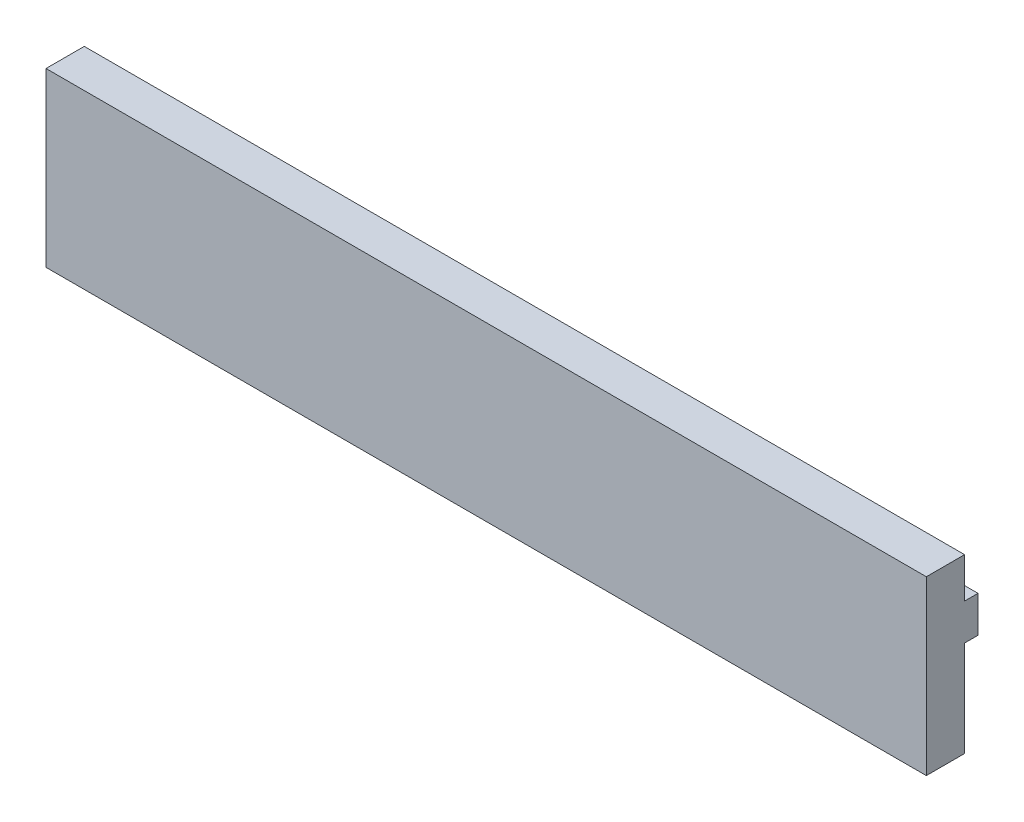
ISO-10303-21;
HEADER;
FILE_DESCRIPTION(('STEP AP214'),'2;1');
FILE_NAME('part.step','',(''),(''),'','','');
FILE_SCHEMA(('AUTOMOTIVE_DESIGN { 1 0 10303 214 1 1 1 1 }'));
ENDSEC;
DATA;
#1=APPLICATION_CONTEXT('core data for automotive mechanical design processes');
#2=APPLICATION_PROTOCOL_DEFINITION('international standard','automotive_design',2000,#1);
#3=PRODUCT_CONTEXT('',#1,'mechanical');
#4=PRODUCT('Part','Part','',(#3));
#5=PRODUCT_RELATED_PRODUCT_CATEGORY('part','',(#4));
#6=PRODUCT_DEFINITION_FORMATION('','',#4);
#7=PRODUCT_DEFINITION_CONTEXT('part definition',#1,'design');
#8=PRODUCT_DEFINITION('design','',#6,#7);
#9=PRODUCT_DEFINITION_SHAPE('','',#8);
#10=(LENGTH_UNIT() NAMED_UNIT(*) SI_UNIT(.MILLI.,.METRE.));
#11=(NAMED_UNIT(*) PLANE_ANGLE_UNIT() SI_UNIT($,.RADIAN.));
#12=(NAMED_UNIT(*) SI_UNIT($,.STERADIAN.) SOLID_ANGLE_UNIT());
#13=UNCERTAINTY_MEASURE_WITH_UNIT(LENGTH_MEASURE(1.E-05),#10,'distance_accuracy_value','');
#14=(GEOMETRIC_REPRESENTATION_CONTEXT(3) GLOBAL_UNCERTAINTY_ASSIGNED_CONTEXT((#13)) GLOBAL_UNIT_ASSIGNED_CONTEXT((#10,
#11,#12)) REPRESENTATION_CONTEXT('',''));
#15=CARTESIAN_POINT('',(0.,0.,0.));
#16=DIRECTION('',(0.,0.,1.));
#17=DIRECTION('',(1.,0.,0.));
#18=AXIS2_PLACEMENT_3D('',#15,#16,#17);
#19=CARTESIAN_POINT('',(0.,0.,0.));
#20=DIRECTION('',(0.,0.,1.));
#21=DIRECTION('',(1.,0.,0.));
#22=AXIS2_PLACEMENT_3D('',#19,#20,#21);
#23=PLANE('',#22);
#24=DIRECTION('',(-1.,0.,0.));
#25=VECTOR('',#24,1.);
#26=CARTESIAN_POINT('',(230.,5.00000000000002,0.));
#27=LINE('',#26,#25);
#28=CARTESIAN_POINT('',(230.,5.00000000000001,0.));
#29=VERTEX_POINT('',#28);
#30=CARTESIAN_POINT('',(-230.,5.00000000000001,0.));
#31=VERTEX_POINT('',#30);
#32=EDGE_CURVE('E57',#29,#31,#27,.T.);
#33=ORIENTED_EDGE('',*,*,#32,.F.);
#34=DIRECTION('',(0.,1.,0.));
#35=VECTOR('',#34,1.);
#36=CARTESIAN_POINT('',(230.,-45.,0.));
#37=LINE('',#36,#35);
#38=CARTESIAN_POINT('',(230.,-45.,0.));
#39=VERTEX_POINT('',#38);
#40=EDGE_CURVE('E162',#39,#29,#37,.T.);
#41=ORIENTED_EDGE('',*,*,#40,.F.);
#42=DIRECTION('',(1.,0.,0.));
#43=VECTOR('',#42,1.);
#44=CARTESIAN_POINT('',(230.,-45.,0.));
#45=LINE('',#44,#43);
#46=CARTESIAN_POINT('',(-230.,-45.,0.));
#47=VERTEX_POINT('',#46);
#48=EDGE_CURVE('E158',#47,#39,#45,.T.);
#49=ORIENTED_EDGE('',*,*,#48,.F.);
#50=DIRECTION('',(0.,-1.,0.));
#51=VECTOR('',#50,1.);
#52=CARTESIAN_POINT('',(-230.,-45.,0.));
#53=LINE('',#52,#51);
#54=EDGE_CURVE('E62',#31,#47,#53,.T.);
#55=ORIENTED_EDGE('',*,*,#54,.F.);
#56=EDGE_LOOP('',(#33,#41,#49,#55));
#57=FACE_BOUND('',#56,.T.);
#58=ADVANCED_FACE('F41',(#57),#23,.F.);
#59=DIRECTION('',(1.,0.,0.));
#60=VECTOR('',#59,1.);
#61=CARTESIAN_POINT('',(230.,24.,0.));
#62=LINE('',#61,#60);
#63=CARTESIAN_POINT('',(-230.,24.,0.));
#64=VERTEX_POINT('',#63);
#65=CARTESIAN_POINT('',(230.,24.,0.));
#66=VERTEX_POINT('',#65);
#67=EDGE_CURVE('E195',#64,#66,#62,.T.);
#68=ORIENTED_EDGE('',*,*,#67,.F.);
#69=CARTESIAN_POINT('',(-230.,45.,0.));
#70=VERTEX_POINT('',#69);
#71=EDGE_CURVE('E132',#70,#64,#53,.T.);
#72=ORIENTED_EDGE('',*,*,#71,.F.);
#73=DIRECTION('',(-1.,0.,0.));
#74=VECTOR('',#73,1.);
#75=CARTESIAN_POINT('',(230.,45.,0.));
#76=LINE('',#75,#74);
#77=CARTESIAN_POINT('',(230.,45.,0.));
#78=VERTEX_POINT('',#77);
#79=EDGE_CURVE('E147',#78,#70,#76,.T.);
#80=ORIENTED_EDGE('',*,*,#79,.F.);
#81=EDGE_CURVE('E161',#66,#78,#37,.T.);
#82=ORIENTED_EDGE('',*,*,#81,.F.);
#83=EDGE_LOOP('',(#68,#72,#80,#82));
#84=FACE_BOUND('',#83,.T.);
#85=ADVANCED_FACE('F210',(#84),#23,.F.);
#86=CARTESIAN_POINT('',(-230.,-45.,20.));
#87=DIRECTION('',(1.,0.,0.));
#88=DIRECTION('',(0.,0.,-1.));
#89=AXIS2_PLACEMENT_3D('',#86,#87,#88);
#90=PLANE('',#89);
#91=ORIENTED_EDGE('',*,*,#71,.T.);
#92=DIRECTION('',(0.,0.,1.));
#93=VECTOR('',#92,1.);
#94=CARTESIAN_POINT('',(-230.,24.,-7.));
#95=LINE('',#94,#93);
#96=CARTESIAN_POINT('',(-230.,24.,-7.));
#97=VERTEX_POINT('',#96);
#98=EDGE_CURVE('E111',#97,#64,#95,.T.);
#99=ORIENTED_EDGE('',*,*,#98,.F.);
#100=DIRECTION('',(0.,1.,0.));
#101=VECTOR('',#100,1.);
#102=CARTESIAN_POINT('',(-230.,24.,-7.));
#103=LINE('',#102,#101);
#104=CARTESIAN_POINT('',(-230.,5.00000000000002,-7.));
#105=VERTEX_POINT('',#104);
#106=EDGE_CURVE('E118',#105,#97,#103,.T.);
#107=ORIENTED_EDGE('',*,*,#106,.F.);
#108=DIRECTION('',(0.,0.,1.));
#109=VECTOR('',#108,1.);
#110=CARTESIAN_POINT('',(-230.,5.00000000000002,-7.));
#111=LINE('',#110,#109);
#112=EDGE_CURVE('E185',#105,#31,#111,.T.);
#113=ORIENTED_EDGE('',*,*,#112,.T.);
#114=ORIENTED_EDGE('',*,*,#54,.T.);
#115=DIRECTION('',(0.,0.,-1.));
#116=VECTOR('',#115,1.);
#117=CARTESIAN_POINT('',(-230.,-45.,20.));
#118=LINE('',#117,#116);
#119=CARTESIAN_POINT('',(-230.,-45.,20.));
#120=VERTEX_POINT('',#119);
#121=EDGE_CURVE('E11',#120,#47,#118,.T.);
#122=ORIENTED_EDGE('',*,*,#121,.F.);
#123=DIRECTION('',(0.,-1.,0.));
#124=VECTOR('',#123,1.);
#125=CARTESIAN_POINT('',(-230.,-45.,20.));
#126=LINE('',#125,#124);
#127=CARTESIAN_POINT('',(-230.,45.,20.));
#128=VERTEX_POINT('',#127);
#129=EDGE_CURVE('E142',#128,#120,#126,.T.);
#130=ORIENTED_EDGE('',*,*,#129,.F.);
#131=DIRECTION('',(0.,0.,-1.));
#132=VECTOR('',#131,1.);
#133=CARTESIAN_POINT('',(-230.,45.,20.));
#134=LINE('',#133,#132);
#135=EDGE_CURVE('E155',#128,#70,#134,.T.);
#136=ORIENTED_EDGE('',*,*,#135,.T.);
#137=EDGE_LOOP('',(#91,#99,#107,#113,#114,#122,#130,#136));
#138=FACE_BOUND('',#137,.T.);
#139=ADVANCED_FACE('F43',(#138),#90,.F.);
#140=CARTESIAN_POINT('',(230.,-45.,20.));
#141=DIRECTION('',(0.,1.,0.));
#142=DIRECTION('',(-1.,0.,0.));
#143=AXIS2_PLACEMENT_3D('',#140,#141,#142);
#144=PLANE('',#143);
#145=ORIENTED_EDGE('',*,*,#48,.T.);
#146=DIRECTION('',(0.,0.,-1.));
#147=VECTOR('',#146,1.);
#148=CARTESIAN_POINT('',(230.,-45.,20.));
#149=LINE('',#148,#147);
#150=CARTESIAN_POINT('',(230.,-45.,20.));
#151=VERTEX_POINT('',#150);
#152=EDGE_CURVE('E50',#151,#39,#149,.T.);
#153=ORIENTED_EDGE('',*,*,#152,.F.);
#154=DIRECTION('',(1.,0.,0.));
#155=VECTOR('',#154,1.);
#156=CARTESIAN_POINT('',(230.,-45.,20.));
#157=LINE('',#156,#155);
#158=EDGE_CURVE('E146',#120,#151,#157,.T.);
#159=ORIENTED_EDGE('',*,*,#158,.F.);
#160=ORIENTED_EDGE('',*,*,#121,.T.);
#161=EDGE_LOOP('',(#145,#153,#159,#160));
#162=FACE_BOUND('',#161,.T.);
#163=ADVANCED_FACE('F183',(#162),#144,.F.);
#164=CARTESIAN_POINT('',(230.,-45.,20.));
#165=DIRECTION('',(-1.,0.,0.));
#166=DIRECTION('',(0.,0.,1.));
#167=AXIS2_PLACEMENT_3D('',#164,#165,#166);
#168=PLANE('',#167);
#169=ORIENTED_EDGE('',*,*,#40,.T.);
#170=DIRECTION('',(0.,0.,1.));
#171=VECTOR('',#170,1.);
#172=CARTESIAN_POINT('',(230.,5.00000000000002,-7.));
#173=LINE('',#172,#171);
#174=CARTESIAN_POINT('',(230.,5.00000000000002,-7.));
#175=VERTEX_POINT('',#174);
#176=EDGE_CURVE('E138',#175,#29,#173,.T.);
#177=ORIENTED_EDGE('',*,*,#176,.F.);
#178=DIRECTION('',(0.,-1.,0.));
#179=VECTOR('',#178,1.);
#180=CARTESIAN_POINT('',(230.,24.,-7.));
#181=LINE('',#180,#179);
#182=CARTESIAN_POINT('',(230.,24.,-7.));
#183=VERTEX_POINT('',#182);
#184=EDGE_CURVE('E117',#183,#175,#181,.T.);
#185=ORIENTED_EDGE('',*,*,#184,.F.);
#186=DIRECTION('',(0.,0.,1.));
#187=VECTOR('',#186,1.);
#188=CARTESIAN_POINT('',(230.,24.,-7.));
#189=LINE('',#188,#187);
#190=EDGE_CURVE('E113',#183,#66,#189,.T.);
#191=ORIENTED_EDGE('',*,*,#190,.T.);
#192=ORIENTED_EDGE('',*,*,#81,.T.);
#193=DIRECTION('',(0.,0.,-1.));
#194=VECTOR('',#193,1.);
#195=CARTESIAN_POINT('',(230.,45.,20.));
#196=LINE('',#195,#194);
#197=CARTESIAN_POINT('',(230.,45.,20.));
#198=VERTEX_POINT('',#197);
#199=EDGE_CURVE('E169',#198,#78,#196,.T.);
#200=ORIENTED_EDGE('',*,*,#199,.F.);
#201=DIRECTION('',(0.,1.,0.));
#202=VECTOR('',#201,1.);
#203=CARTESIAN_POINT('',(230.,-45.,20.));
#204=LINE('',#203,#202);
#205=EDGE_CURVE('E150',#151,#198,#204,.T.);
#206=ORIENTED_EDGE('',*,*,#205,.F.);
#207=ORIENTED_EDGE('',*,*,#152,.T.);
#208=EDGE_LOOP('',(#169,#177,#185,#191,#192,#200,#206,#207));
#209=FACE_BOUND('',#208,.T.);
#210=ADVANCED_FACE('F177',(#209),#168,.F.);
#211=CARTESIAN_POINT('',(230.,45.,20.));
#212=DIRECTION('',(0.,-1.,0.));
#213=DIRECTION('',(1.,0.,0.));
#214=AXIS2_PLACEMENT_3D('',#211,#212,#213);
#215=PLANE('',#214);
#216=ORIENTED_EDGE('',*,*,#79,.T.);
#217=ORIENTED_EDGE('',*,*,#135,.F.);
#218=DIRECTION('',(-1.,0.,0.));
#219=VECTOR('',#218,1.);
#220=CARTESIAN_POINT('',(230.,45.,20.));
#221=LINE('',#220,#219);
#222=EDGE_CURVE('E153',#198,#128,#221,.T.);
#223=ORIENTED_EDGE('',*,*,#222,.F.);
#224=ORIENTED_EDGE('',*,*,#199,.T.);
#225=EDGE_LOOP('',(#216,#217,#223,#224));
#226=FACE_BOUND('',#225,.T.);
#227=ADVANCED_FACE('F218',(#226),#215,.F.);
#228=CARTESIAN_POINT('',(0.,0.,20.));
#229=DIRECTION('',(0.,0.,1.));
#230=DIRECTION('',(1.,0.,0.));
#231=AXIS2_PLACEMENT_3D('',#228,#229,#230);
#232=PLANE('',#231);
#233=ORIENTED_EDGE('',*,*,#129,.T.);
#234=ORIENTED_EDGE('',*,*,#158,.T.);
#235=ORIENTED_EDGE('',*,*,#205,.T.);
#236=ORIENTED_EDGE('',*,*,#222,.T.);
#237=EDGE_LOOP('',(#233,#234,#235,#236));
#238=FACE_BOUND('',#237,.T.);
#239=ADVANCED_FACE('F207',(#238),#232,.T.);
#240=CARTESIAN_POINT('',(230.,24.,-7.));
#241=DIRECTION('',(0.,-1.,0.));
#242=DIRECTION('',(0.,0.,-1.));
#243=AXIS2_PLACEMENT_3D('',#240,#241,#242);
#244=PLANE('',#243);
#245=ORIENTED_EDGE('',*,*,#67,.T.);
#246=ORIENTED_EDGE('',*,*,#190,.F.);
#247=DIRECTION('',(1.,0.,0.));
#248=VECTOR('',#247,1.);
#249=CARTESIAN_POINT('',(230.,24.,-7.));
#250=LINE('',#249,#248);
#251=EDGE_CURVE('E106',#97,#183,#250,.T.);
#252=ORIENTED_EDGE('',*,*,#251,.F.);
#253=ORIENTED_EDGE('',*,*,#98,.T.);
#254=EDGE_LOOP('',(#245,#246,#252,#253));
#255=FACE_BOUND('',#254,.T.);
#256=ADVANCED_FACE('F109',(#255),#244,.F.);
#257=CARTESIAN_POINT('',(230.,5.00000000000002,-7.));
#258=DIRECTION('',(0.,1.,0.));
#259=DIRECTION('',(0.,0.,1.));
#260=AXIS2_PLACEMENT_3D('',#257,#258,#259);
#261=PLANE('',#260);
#262=ORIENTED_EDGE('',*,*,#32,.T.);
#263=ORIENTED_EDGE('',*,*,#112,.F.);
#264=DIRECTION('',(-1.,0.,0.));
#265=VECTOR('',#264,1.);
#266=CARTESIAN_POINT('',(230.,5.00000000000002,-7.));
#267=LINE('',#266,#265);
#268=EDGE_CURVE('E123',#175,#105,#267,.T.);
#269=ORIENTED_EDGE('',*,*,#268,.F.);
#270=ORIENTED_EDGE('',*,*,#176,.T.);
#271=EDGE_LOOP('',(#262,#263,#269,#270));
#272=FACE_BOUND('',#271,.T.);
#273=ADVANCED_FACE('F199',(#272),#261,.F.);
#274=CARTESIAN_POINT('',(0.,0.,-7.));
#275=DIRECTION('',(0.,0.,-1.));
#276=DIRECTION('',(-1.,0.,0.));
#277=AXIS2_PLACEMENT_3D('',#274,#275,#276);
#278=PLANE('',#277);
#279=ORIENTED_EDGE('',*,*,#106,.T.);
#280=ORIENTED_EDGE('',*,*,#251,.T.);
#281=ORIENTED_EDGE('',*,*,#184,.T.);
#282=ORIENTED_EDGE('',*,*,#268,.T.);
#283=EDGE_LOOP('',(#279,#280,#281,#282));
#284=FACE_BOUND('',#283,.T.);
#285=ADVANCED_FACE('F121',(#284),#278,.T.);
#286=CLOSED_SHELL('',(#58,#85,#139,#163,#210,#227,#239,#256,#273,#285));
#287=MANIFOLD_SOLID_BREP('B2',#286);
#288=ADVANCED_BREP_SHAPE_REPRESENTATION('',(#18,#287),#14);
#289=SHAPE_DEFINITION_REPRESENTATION(#9,#288);
ENDSEC;
END-ISO-10303-21;
